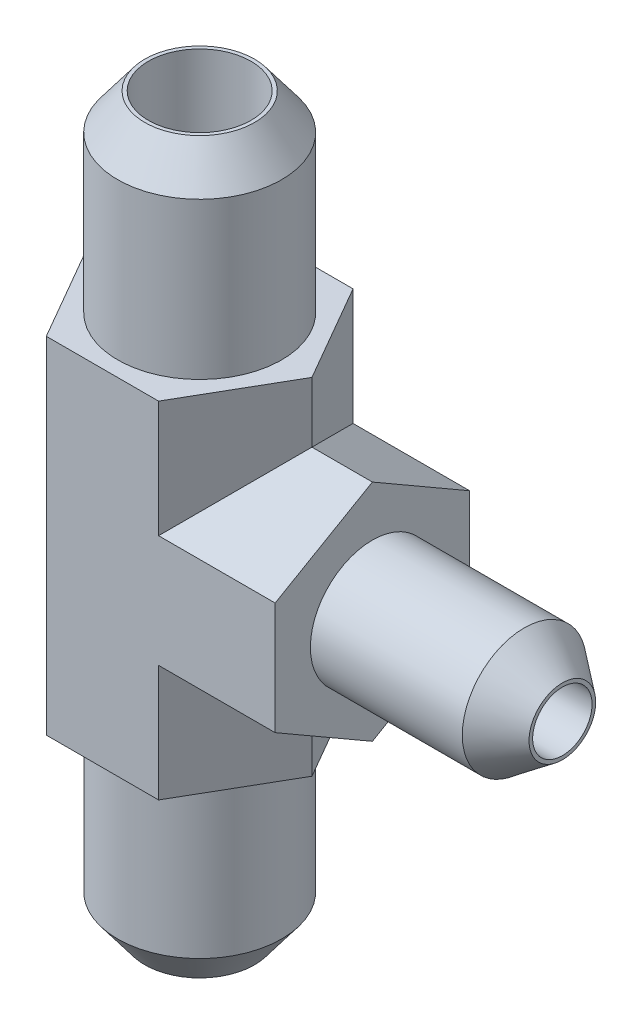
ISO-10303-21;
HEADER;
FILE_DESCRIPTION(('STEP AP214'),'2;1');
FILE_NAME('part.step','',(''),(''),'','','');
FILE_SCHEMA(('AUTOMOTIVE_DESIGN { 1 0 10303 214 1 1 1 1 }'));
ENDSEC;
DATA;
#1=APPLICATION_CONTEXT('core data for automotive mechanical design processes');
#2=APPLICATION_PROTOCOL_DEFINITION('international standard','automotive_design',2000,#1);
#3=PRODUCT_CONTEXT('',#1,'mechanical');
#4=PRODUCT('Part','Part','',(#3));
#5=PRODUCT_RELATED_PRODUCT_CATEGORY('part','',(#4));
#6=PRODUCT_DEFINITION_FORMATION('','',#4);
#7=PRODUCT_DEFINITION_CONTEXT('part definition',#1,'design');
#8=PRODUCT_DEFINITION('design','',#6,#7);
#9=PRODUCT_DEFINITION_SHAPE('','',#8);
#10=(LENGTH_UNIT() NAMED_UNIT(*) SI_UNIT(.MILLI.,.METRE.));
#11=(NAMED_UNIT(*) PLANE_ANGLE_UNIT() SI_UNIT($,.RADIAN.));
#12=(NAMED_UNIT(*) SI_UNIT($,.STERADIAN.) SOLID_ANGLE_UNIT());
#13=UNCERTAINTY_MEASURE_WITH_UNIT(LENGTH_MEASURE(1.E-05),#10,'distance_accuracy_value','');
#14=(GEOMETRIC_REPRESENTATION_CONTEXT(3) GLOBAL_UNCERTAINTY_ASSIGNED_CONTEXT((#13)) GLOBAL_UNIT_ASSIGNED_CONTEXT((#10,
#11,#12)) REPRESENTATION_CONTEXT('',''));
#15=CARTESIAN_POINT('',(0.,0.,0.));
#16=DIRECTION('',(0.,0.,1.));
#17=DIRECTION('',(1.,0.,0.));
#18=AXIS2_PLACEMENT_3D('',#15,#16,#17);
#19=CARTESIAN_POINT('',(0.,-26.8224,0.));
#20=DIRECTION('',(0.,1.,0.));
#21=DIRECTION('',(0.,0.,1.));
#22=AXIS2_PLACEMENT_3D('',#19,#20,#21);
#23=CYLINDRICAL_SURFACE('',#22,6.0325);
#24=CARTESIAN_POINT('',(0.,-12.7,0.));
#25=DIRECTION('',(0.,-1.,0.));
#26=DIRECTION('',(0.,0.,-1.));
#27=AXIS2_PLACEMENT_3D('',#24,#25,#26);
#28=CIRCLE('',#27,6.0325);
#29=CARTESIAN_POINT('',(0.,-12.7,-6.0325));
#30=VERTEX_POINT('',#29);
#31=EDGE_CURVE('E11',#30,#30,#28,.T.);
#32=ORIENTED_EDGE('',*,*,#31,.T.);
#33=EDGE_LOOP('',(#32));
#34=FACE_BOUND('',#33,.T.);
#35=CARTESIAN_POINT('',(0.,-24.1764053301711,0.));
#36=DIRECTION('',(0.,1.,0.));
#37=DIRECTION('',(0.,0.,1.));
#38=AXIS2_PLACEMENT_3D('',#35,#36,#37);
#39=CIRCLE('',#38,6.0325);
#40=CARTESIAN_POINT('',(0.,-24.1764053301711,6.0325));
#41=VERTEX_POINT('',#40);
#42=EDGE_CURVE('E510',#41,#41,#39,.F.);
#43=ORIENTED_EDGE('',*,*,#42,.F.);
#44=EDGE_LOOP('',(#43));
#45=FACE_BOUND('',#44,.T.);
#46=ADVANCED_FACE('F34',(#34,#45),#23,.T.);
#47=CARTESIAN_POINT('',(26.67,0.,0.));
#48=DIRECTION('',(-1.,0.,0.));
#49=DIRECTION('',(0.,0.,1.));
#50=AXIS2_PLACEMENT_3D('',#47,#48,#49);
#51=CYLINDRICAL_SURFACE('',#50,4.5593);
#52=CARTESIAN_POINT('',(12.7,0.,0.));
#53=DIRECTION('',(1.,0.,0.));
#54=DIRECTION('',(0.,0.,-1.));
#55=AXIS2_PLACEMENT_3D('',#52,#53,#54);
#56=CIRCLE('',#55,4.5593);
#57=CARTESIAN_POINT('',(12.7,0.,-4.5593));
#58=VERTEX_POINT('',#57);
#59=EDGE_CURVE('E43',#58,#58,#56,.T.);
#60=ORIENTED_EDGE('',*,*,#59,.T.);
#61=EDGE_LOOP('',(#60));
#62=FACE_BOUND('',#61,.T.);
#63=CARTESIAN_POINT('',(23.8723241070599,0.,0.));
#64=DIRECTION('',(-1.,0.,0.));
#65=DIRECTION('',(0.,0.,1.));
#66=AXIS2_PLACEMENT_3D('',#63,#64,#65);
#67=CIRCLE('',#66,4.5593);
#68=CARTESIAN_POINT('',(23.8723241070599,0.,4.5593));
#69=VERTEX_POINT('',#68);
#70=EDGE_CURVE('E177',#69,#69,#67,.F.);
#71=ORIENTED_EDGE('',*,*,#70,.F.);
#72=EDGE_LOOP('',(#71));
#73=FACE_BOUND('',#72,.T.);
#74=ADVANCED_FACE('F278',(#62,#73),#51,.T.);
#75=CARTESIAN_POINT('',(4.12811215973278,12.7,7.15009999999998));
#76=DIRECTION('',(-0.866025403784442,0.,-0.499999999999995));
#77=DIRECTION('',(-0.499999999999995,0.,0.866025403784442));
#78=AXIS2_PLACEMENT_3D('',#75,#76,#77);
#79=PLANE('',#78);
#80=DIRECTION('',(-0.447213595499953,-0.447213595499959,0.774596669241486));
#81=VECTOR('',#80,1.);
#82=CARTESIAN_POINT('',(5.84248972778622,5.8424897277862,4.18071094877502));
#83=LINE('',#82,#81);
#84=CARTESIAN_POINT('',(8.25622431946552,8.25622431946547,0.));
#85=VERTEX_POINT('',#84);
#86=CARTESIAN_POINT('',(4.12811215973278,4.12811215973273,7.15009999999998));
#87=VERTEX_POINT('',#86);
#88=EDGE_CURVE('E38',#85,#87,#83,.T.);
#89=ORIENTED_EDGE('',*,*,#88,.F.);
#90=DIRECTION('',(0.,-1.,0.));
#91=VECTOR('',#90,1.);
#92=CARTESIAN_POINT('',(8.25622431946549,12.7,0.));
#93=LINE('',#92,#91);
#94=CARTESIAN_POINT('',(8.25622431946549,12.7,0.));
#95=VERTEX_POINT('',#94);
#96=EDGE_CURVE('E116',#95,#85,#93,.T.);
#97=ORIENTED_EDGE('',*,*,#96,.F.);
#98=DIRECTION('',(0.499999999999995,0.,-0.866025403784442));
#99=VECTOR('',#98,1.);
#100=CARTESIAN_POINT('',(4.12811215973278,12.7,7.15009999999998));
#101=LINE('',#100,#99);
#102=CARTESIAN_POINT('',(4.12811215973278,12.7,7.15009999999998));
#103=VERTEX_POINT('',#102);
#104=EDGE_CURVE('E102',#103,#95,#101,.T.);
#105=ORIENTED_EDGE('',*,*,#104,.F.);
#106=DIRECTION('',(0.,-1.,0.));
#107=VECTOR('',#106,1.);
#108=CARTESIAN_POINT('',(4.12811215973278,12.7,7.15009999999998));
#109=LINE('',#108,#107);
#110=EDGE_CURVE('E153',#103,#87,#109,.T.);
#111=ORIENTED_EDGE('',*,*,#110,.T.);
#112=EDGE_LOOP('',(#89,#97,#105,#111));
#113=FACE_BOUND('',#112,.T.);
#114=ADVANCED_FACE('F117',(#113),#79,.F.);
#115=DIRECTION('',(0.447213595499953,-0.447213595499959,-0.774596669241485));
#116=VECTOR('',#115,1.);
#117=CARTESIAN_POINT('',(0.762489727786258,-0.762489727786166,12.979529051225));
#118=LINE('',#117,#116);
#119=CARTESIAN_POINT('',(4.12811215973278,-4.12811215973273,7.15009999999998));
#120=VERTEX_POINT('',#119);
#121=CARTESIAN_POINT('',(8.25622431946552,-8.25622431946546,0.));
#122=VERTEX_POINT('',#121);
#123=EDGE_CURVE('E159',#120,#122,#118,.T.);
#124=ORIENTED_EDGE('',*,*,#123,.F.);
#125=CARTESIAN_POINT('',(4.12811215973278,-12.7,7.15009999999998));
#126=VERTEX_POINT('',#125);
#127=EDGE_CURVE('E122',#120,#126,#109,.T.);
#128=ORIENTED_EDGE('',*,*,#127,.T.);
#129=DIRECTION('',(0.499999999999995,0.,-0.866025403784442));
#130=VECTOR('',#129,1.);
#131=CARTESIAN_POINT('',(4.12811215973278,-12.7,7.15009999999998));
#132=LINE('',#131,#130);
#133=CARTESIAN_POINT('',(8.25622431946549,-12.7,0.));
#134=VERTEX_POINT('',#133);
#135=EDGE_CURVE('E142',#126,#134,#132,.T.);
#136=ORIENTED_EDGE('',*,*,#135,.T.);
#137=EDGE_CURVE('E123',#122,#134,#93,.T.);
#138=ORIENTED_EDGE('',*,*,#137,.F.);
#139=EDGE_LOOP('',(#124,#128,#136,#138));
#140=FACE_BOUND('',#139,.T.);
#141=ADVANCED_FACE('F258',(#140),#79,.F.);
#142=CARTESIAN_POINT('',(8.25622431946549,12.7,0.));
#143=DIRECTION('',(-0.866025403784435,0.,0.500000000000007));
#144=DIRECTION('',(0.500000000000007,0.,0.866025403784435));
#145=AXIS2_PLACEMENT_3D('',#142,#143,#144);
#146=PLANE('',#145);
#147=DIRECTION('',(0.447213595499965,0.447213595499956,0.77459666924148));
#148=VECTOR('',#147,1.);
#149=CARTESIAN_POINT('',(9.14497945557241,9.14497945557234,1.5393690512249));
#150=LINE('',#149,#148);
#151=CARTESIAN_POINT('',(4.12811215973268,4.12811215973274,-7.15009999999998));
#152=VERTEX_POINT('',#151);
#153=EDGE_CURVE('E137',#152,#85,#150,.T.);
#154=ORIENTED_EDGE('',*,*,#153,.F.);
#155=DIRECTION('',(0.,-1.,0.));
#156=VECTOR('',#155,1.);
#157=CARTESIAN_POINT('',(4.12811215973268,12.7,-7.15010000000004));
#158=LINE('',#157,#156);
#159=CARTESIAN_POINT('',(4.12811215973268,12.7,-7.15010000000004));
#160=VERTEX_POINT('',#159);
#161=EDGE_CURVE('E127',#160,#152,#158,.T.);
#162=ORIENTED_EDGE('',*,*,#161,.F.);
#163=DIRECTION('',(-0.500000000000007,0.,-0.866025403784435));
#164=VECTOR('',#163,1.);
#165=CARTESIAN_POINT('',(8.25622431946549,12.7,0.));
#166=LINE('',#165,#164);
#167=EDGE_CURVE('E106',#95,#160,#166,.T.);
#168=ORIENTED_EDGE('',*,*,#167,.F.);
#169=ORIENTED_EDGE('',*,*,#96,.T.);
#170=EDGE_LOOP('',(#154,#162,#168,#169));
#171=FACE_BOUND('',#170,.T.);
#172=ADVANCED_FACE('F125',(#171),#146,.F.);
#173=DIRECTION('',(-0.447213595499965,0.447213595499956,-0.774596669241481));
#174=VECTOR('',#173,1.);
#175=CARTESIAN_POINT('',(4.06497945557236,-4.06497945557238,-7.25944905122493));
#176=LINE('',#175,#174);
#177=CARTESIAN_POINT('',(4.12811215973268,-4.12811215973271,-7.15010000000004));
#178=VERTEX_POINT('',#177);
#179=EDGE_CURVE('E209',#122,#178,#176,.T.);
#180=ORIENTED_EDGE('',*,*,#179,.F.);
#181=ORIENTED_EDGE('',*,*,#137,.T.);
#182=DIRECTION('',(-0.500000000000007,0.,-0.866025403784435));
#183=VECTOR('',#182,1.);
#184=CARTESIAN_POINT('',(8.25622431946549,-12.7,0.));
#185=LINE('',#184,#183);
#186=CARTESIAN_POINT('',(4.12811215973268,-12.7,-7.15010000000004));
#187=VERTEX_POINT('',#186);
#188=EDGE_CURVE('E145',#134,#187,#185,.T.);
#189=ORIENTED_EDGE('',*,*,#188,.T.);
#190=EDGE_CURVE('E151',#178,#187,#158,.T.);
#191=ORIENTED_EDGE('',*,*,#190,.F.);
#192=EDGE_LOOP('',(#180,#181,#189,#191));
#193=FACE_BOUND('',#192,.T.);
#194=ADVANCED_FACE('F262',(#193),#146,.F.);
#195=CARTESIAN_POINT('',(-4.12811215973283,12.7,-7.15009999999995));
#196=DIRECTION('',(0.866025403784442,0.,0.499999999999995));
#197=DIRECTION('',(0.499999999999995,0.,-0.866025403784442));
#198=AXIS2_PLACEMENT_3D('',#195,#196,#197);
#199=PLANE('',#198);
#200=DIRECTION('',(-0.499999999999995,0.,0.866025403784442));
#201=VECTOR('',#200,1.);
#202=CARTESIAN_POINT('',(-4.12811215973283,-12.7,-7.15009999999995));
#203=LINE('',#202,#201);
#204=CARTESIAN_POINT('',(-4.12811215973283,-12.7,-7.15009999999995));
#205=VERTEX_POINT('',#204);
#206=CARTESIAN_POINT('',(-8.25622431946549,-12.7,0.));
#207=VERTEX_POINT('',#206);
#208=EDGE_CURVE('E133',#205,#207,#203,.T.);
#209=ORIENTED_EDGE('',*,*,#208,.T.);
#210=DIRECTION('',(0.,-1.,0.));
#211=VECTOR('',#210,1.);
#212=CARTESIAN_POINT('',(-8.25622431946549,12.7,0.));
#213=LINE('',#212,#211);
#214=CARTESIAN_POINT('',(-8.25622431946549,12.7,0.));
#215=VERTEX_POINT('',#214);
#216=EDGE_CURVE('E158',#215,#207,#213,.T.);
#217=ORIENTED_EDGE('',*,*,#216,.F.);
#218=DIRECTION('',(-0.499999999999995,0.,0.866025403784442));
#219=VECTOR('',#218,1.);
#220=CARTESIAN_POINT('',(-4.12811215973283,12.7,-7.15009999999995));
#221=LINE('',#220,#219);
#222=CARTESIAN_POINT('',(-4.12811215973283,12.7,-7.15009999999995));
#223=VERTEX_POINT('',#222);
#224=EDGE_CURVE('E149',#223,#215,#221,.T.);
#225=ORIENTED_EDGE('',*,*,#224,.F.);
#226=DIRECTION('',(0.,-1.,0.));
#227=VECTOR('',#226,1.);
#228=CARTESIAN_POINT('',(-4.12811215973283,12.7,-7.15009999999995));
#229=LINE('',#228,#227);
#230=EDGE_CURVE('E129',#223,#205,#229,.T.);
#231=ORIENTED_EDGE('',*,*,#230,.T.);
#232=EDGE_LOOP('',(#209,#217,#225,#231));
#233=FACE_BOUND('',#232,.T.);
#234=ADVANCED_FACE('F36',(#233),#199,.F.);
#235=CARTESIAN_POINT('',(-8.25622431946549,12.7,0.));
#236=DIRECTION('',(0.866025403784438,0.,-0.500000000000001));
#237=DIRECTION('',(-0.500000000000001,0.,-0.866025403784438));
#238=AXIS2_PLACEMENT_3D('',#235,#236,#237);
#239=PLANE('',#238);
#240=DIRECTION('',(0.500000000000001,0.,0.866025403784438));
#241=VECTOR('',#240,1.);
#242=CARTESIAN_POINT('',(-8.25622431946549,-12.7,0.));
#243=LINE('',#242,#241);
#244=CARTESIAN_POINT('',(-4.12811215973273,-12.7,7.15010000000001));
#245=VERTEX_POINT('',#244);
#246=EDGE_CURVE('E136',#207,#245,#243,.T.);
#247=ORIENTED_EDGE('',*,*,#246,.T.);
#248=DIRECTION('',(0.,-1.,0.));
#249=VECTOR('',#248,1.);
#250=CARTESIAN_POINT('',(-4.12811215973273,12.7,7.15010000000001));
#251=LINE('',#250,#249);
#252=CARTESIAN_POINT('',(-4.12811215973273,12.7,7.15010000000001));
#253=VERTEX_POINT('',#252);
#254=EDGE_CURVE('E155',#253,#245,#251,.T.);
#255=ORIENTED_EDGE('',*,*,#254,.F.);
#256=DIRECTION('',(0.500000000000001,0.,0.866025403784438));
#257=VECTOR('',#256,1.);
#258=CARTESIAN_POINT('',(-8.25622431946549,12.7,0.));
#259=LINE('',#258,#257);
#260=EDGE_CURVE('E93',#215,#253,#259,.T.);
#261=ORIENTED_EDGE('',*,*,#260,.F.);
#262=ORIENTED_EDGE('',*,*,#216,.T.);
#263=EDGE_LOOP('',(#247,#255,#261,#262));
#264=FACE_BOUND('',#263,.T.);
#265=ADVANCED_FACE('F216',(#264),#239,.F.);
#266=CARTESIAN_POINT('',(-4.12811215973273,12.7,7.15010000000001));
#267=DIRECTION('',(0.,0.,-1.));
#268=DIRECTION('',(-1.,0.,0.));
#269=AXIS2_PLACEMENT_3D('',#266,#267,#268);
#270=PLANE('',#269);
#271=ORIENTED_EDGE('',*,*,#127,.F.);
#272=DIRECTION('',(-1.,0.,0.));
#273=VECTOR('',#272,1.);
#274=CARTESIAN_POINT('',(12.7,-4.12811215973273,7.15009999999998));
#275=LINE('',#274,#273);
#276=CARTESIAN_POINT('',(12.7,-4.12811215973273,7.15009999999998));
#277=VERTEX_POINT('',#276);
#278=EDGE_CURVE('E203',#277,#120,#275,.T.);
#279=ORIENTED_EDGE('',*,*,#278,.F.);
#280=DIRECTION('',(0.,-1.,0.));
#281=VECTOR('',#280,1.);
#282=CARTESIAN_POINT('',(12.7,4.12811215973273,7.15009999999998));
#283=LINE('',#282,#281);
#284=CARTESIAN_POINT('',(12.7,4.12811215973273,7.15009999999998));
#285=VERTEX_POINT('',#284);
#286=EDGE_CURVE('E185',#285,#277,#283,.T.);
#287=ORIENTED_EDGE('',*,*,#286,.F.);
#288=DIRECTION('',(-1.,0.,0.));
#289=VECTOR('',#288,1.);
#290=CARTESIAN_POINT('',(12.7,4.12811215973273,7.15009999999998));
#291=LINE('',#290,#289);
#292=EDGE_CURVE('E205',#285,#87,#291,.T.);
#293=ORIENTED_EDGE('',*,*,#292,.T.);
#294=ORIENTED_EDGE('',*,*,#110,.F.);
#295=DIRECTION('',(1.,0.,0.));
#296=VECTOR('',#295,1.);
#297=CARTESIAN_POINT('',(-4.12811215973273,12.7,7.15010000000001));
#298=LINE('',#297,#296);
#299=EDGE_CURVE('E109',#253,#103,#298,.T.);
#300=ORIENTED_EDGE('',*,*,#299,.F.);
#301=ORIENTED_EDGE('',*,*,#254,.T.);
#302=DIRECTION('',(1.,0.,0.));
#303=VECTOR('',#302,1.);
#304=CARTESIAN_POINT('',(-4.12811215973273,-12.7,7.15010000000001));
#305=LINE('',#304,#303);
#306=EDGE_CURVE('E139',#245,#126,#305,.T.);
#307=ORIENTED_EDGE('',*,*,#306,.T.);
#308=EDGE_LOOP('',(#271,#279,#287,#293,#294,#300,#301,#307));
#309=FACE_BOUND('',#308,.T.);
#310=ADVANCED_FACE('F220',(#309),#270,.F.);
#311=CARTESIAN_POINT('',(4.12811215973268,12.7,-7.15010000000004));
#312=DIRECTION('',(0.,0.,1.));
#313=DIRECTION('',(1.,0.,0.));
#314=AXIS2_PLACEMENT_3D('',#311,#312,#313);
#315=PLANE('',#314);
#316=ORIENTED_EDGE('',*,*,#161,.T.);
#317=DIRECTION('',(-1.,0.,0.));
#318=VECTOR('',#317,1.);
#319=CARTESIAN_POINT('',(12.7,4.12811215973274,-7.15009999999998));
#320=LINE('',#319,#318);
#321=CARTESIAN_POINT('',(12.7,4.12811215973274,-7.15009999999998));
#322=VERTEX_POINT('',#321);
#323=EDGE_CURVE('E197',#322,#152,#320,.T.);
#324=ORIENTED_EDGE('',*,*,#323,.F.);
#325=DIRECTION('',(0.,1.,0.));
#326=VECTOR('',#325,1.);
#327=CARTESIAN_POINT('',(12.7,-4.12811215973273,-7.15009999999998));
#328=LINE('',#327,#326);
#329=CARTESIAN_POINT('',(12.7,-4.12811215973273,-7.15009999999998));
#330=VERTEX_POINT('',#329);
#331=EDGE_CURVE('E194',#330,#322,#328,.T.);
#332=ORIENTED_EDGE('',*,*,#331,.F.);
#333=DIRECTION('',(-1.,0.,0.));
#334=VECTOR('',#333,1.);
#335=CARTESIAN_POINT('',(12.7,-4.12811215973273,-7.15009999999998));
#336=LINE('',#335,#334);
#337=EDGE_CURVE('E51',#330,#178,#336,.T.);
#338=ORIENTED_EDGE('',*,*,#337,.T.);
#339=ORIENTED_EDGE('',*,*,#190,.T.);
#340=DIRECTION('',(-1.,0.,0.));
#341=VECTOR('',#340,1.);
#342=CARTESIAN_POINT('',(4.12811215973268,-12.7,-7.15010000000004));
#343=LINE('',#342,#341);
#344=EDGE_CURVE('E84',#187,#205,#343,.T.);
#345=ORIENTED_EDGE('',*,*,#344,.T.);
#346=ORIENTED_EDGE('',*,*,#230,.F.);
#347=DIRECTION('',(-1.,0.,0.));
#348=VECTOR('',#347,1.);
#349=CARTESIAN_POINT('',(4.12811215973268,12.7,-7.15010000000004));
#350=LINE('',#349,#348);
#351=EDGE_CURVE('E60',#160,#223,#350,.T.);
#352=ORIENTED_EDGE('',*,*,#351,.F.);
#353=EDGE_LOOP('',(#316,#324,#332,#338,#339,#345,#346,#352));
#354=FACE_BOUND('',#353,.T.);
#355=ADVANCED_FACE('F250',(#354),#315,.F.);
#356=CARTESIAN_POINT('',(0.,12.7,0.));
#357=DIRECTION('',(0.,1.,0.));
#358=DIRECTION('',(0.,0.,1.));
#359=AXIS2_PLACEMENT_3D('',#356,#357,#358);
#360=PLANE('',#359);
#361=CARTESIAN_POINT('',(0.,12.7,0.));
#362=DIRECTION('',(0.,-1.,0.));
#363=DIRECTION('',(0.,0.,-1.));
#364=AXIS2_PLACEMENT_3D('',#361,#362,#363);
#365=CIRCLE('',#364,6.0325);
#366=CARTESIAN_POINT('',(0.,12.7,-6.0325));
#367=VERTEX_POINT('',#366);
#368=EDGE_CURVE('E504',#367,#367,#365,.T.);
#369=ORIENTED_EDGE('',*,*,#368,.T.);
#370=EDGE_LOOP('',(#369));
#371=FACE_BOUND('',#370,.T.);
#372=ORIENTED_EDGE('',*,*,#224,.T.);
#373=ORIENTED_EDGE('',*,*,#260,.T.);
#374=ORIENTED_EDGE('',*,*,#299,.T.);
#375=ORIENTED_EDGE('',*,*,#104,.T.);
#376=ORIENTED_EDGE('',*,*,#167,.T.);
#377=ORIENTED_EDGE('',*,*,#351,.T.);
#378=EDGE_LOOP('',(#372,#373,#374,#375,#376,#377));
#379=FACE_BOUND('',#378,.T.);
#380=ADVANCED_FACE('F104',(#371,#379),#360,.T.);
#381=CARTESIAN_POINT('',(0.,-12.7,0.));
#382=DIRECTION('',(0.,1.,0.));
#383=DIRECTION('',(0.,0.,1.));
#384=AXIS2_PLACEMENT_3D('',#381,#382,#383);
#385=PLANE('',#384);
#386=ORIENTED_EDGE('',*,*,#31,.F.);
#387=EDGE_LOOP('',(#386));
#388=FACE_BOUND('',#387,.T.);
#389=ORIENTED_EDGE('',*,*,#208,.F.);
#390=ORIENTED_EDGE('',*,*,#344,.F.);
#391=ORIENTED_EDGE('',*,*,#188,.F.);
#392=ORIENTED_EDGE('',*,*,#135,.F.);
#393=ORIENTED_EDGE('',*,*,#306,.F.);
#394=ORIENTED_EDGE('',*,*,#246,.F.);
#395=EDGE_LOOP('',(#389,#390,#391,#392,#393,#394));
#396=FACE_BOUND('',#395,.T.);
#397=ADVANCED_FACE('F254',(#388,#396),#385,.F.);
#398=CARTESIAN_POINT('',(12.7,8.25622431946547,0.));
#399=DIRECTION('',(0.,-0.866025403784439,-0.5));
#400=DIRECTION('',(0.,0.5,-0.866025403784439));
#401=AXIS2_PLACEMENT_3D('',#398,#399,#400);
#402=PLANE('',#401);
#403=DIRECTION('',(-1.,0.,0.));
#404=VECTOR('',#403,1.);
#405=CARTESIAN_POINT('',(12.7,8.25622431946547,0.));
#406=LINE('',#405,#404);
#407=CARTESIAN_POINT('',(12.7,8.25622431946547,0.));
#408=VERTEX_POINT('',#407);
#409=EDGE_CURVE('E207',#408,#85,#406,.T.);
#410=ORIENTED_EDGE('',*,*,#409,.T.);
#411=ORIENTED_EDGE('',*,*,#88,.T.);
#412=ORIENTED_EDGE('',*,*,#292,.F.);
#413=DIRECTION('',(0.,-0.5,0.866025403784439));
#414=VECTOR('',#413,1.);
#415=CARTESIAN_POINT('',(12.7,8.25622431946547,0.));
#416=LINE('',#415,#414);
#417=EDGE_CURVE('E182',#408,#285,#416,.T.);
#418=ORIENTED_EDGE('',*,*,#417,.F.);
#419=EDGE_LOOP('',(#410,#411,#412,#418));
#420=FACE_BOUND('',#419,.T.);
#421=ADVANCED_FACE('F242',(#420),#402,.F.);
#422=CARTESIAN_POINT('',(12.7,-4.12811215973273,7.15009999999998));
#423=DIRECTION('',(0.,0.866025403784439,-0.5));
#424=DIRECTION('',(0.,0.5,0.866025403784439));
#425=AXIS2_PLACEMENT_3D('',#422,#423,#424);
#426=PLANE('',#425);
#427=ORIENTED_EDGE('',*,*,#278,.T.);
#428=ORIENTED_EDGE('',*,*,#123,.T.);
#429=DIRECTION('',(-1.,0.,0.));
#430=VECTOR('',#429,1.);
#431=CARTESIAN_POINT('',(12.7,-8.25622431946546,0.));
#432=LINE('',#431,#430);
#433=CARTESIAN_POINT('',(12.7,-8.25622431946546,0.));
#434=VERTEX_POINT('',#433);
#435=EDGE_CURVE('E201',#434,#122,#432,.T.);
#436=ORIENTED_EDGE('',*,*,#435,.F.);
#437=DIRECTION('',(0.,-0.5,-0.866025403784439));
#438=VECTOR('',#437,1.);
#439=CARTESIAN_POINT('',(12.7,-4.12811215973273,7.15009999999998));
#440=LINE('',#439,#438);
#441=EDGE_CURVE('E188',#277,#434,#440,.T.);
#442=ORIENTED_EDGE('',*,*,#441,.F.);
#443=EDGE_LOOP('',(#427,#428,#436,#442));
#444=FACE_BOUND('',#443,.T.);
#445=ADVANCED_FACE('F267',(#444),#426,.F.);
#446=CARTESIAN_POINT('',(12.7,4.12811215973274,-7.15009999999998));
#447=DIRECTION('',(0.,-0.866025403784439,0.5));
#448=DIRECTION('',(0.,-0.5,-0.866025403784439));
#449=AXIS2_PLACEMENT_3D('',#446,#447,#448);
#450=PLANE('',#449);
#451=ORIENTED_EDGE('',*,*,#323,.T.);
#452=ORIENTED_EDGE('',*,*,#153,.T.);
#453=ORIENTED_EDGE('',*,*,#409,.F.);
#454=DIRECTION('',(0.,0.5,0.866025403784439));
#455=VECTOR('',#454,1.);
#456=CARTESIAN_POINT('',(12.7,4.12811215973274,-7.15009999999998));
#457=LINE('',#456,#455);
#458=EDGE_CURVE('E179',#322,#408,#457,.T.);
#459=ORIENTED_EDGE('',*,*,#458,.F.);
#460=EDGE_LOOP('',(#451,#452,#453,#459));
#461=FACE_BOUND('',#460,.T.);
#462=ADVANCED_FACE('F249',(#461),#450,.F.);
#463=CARTESIAN_POINT('',(12.7,-8.25622431946546,0.));
#464=DIRECTION('',(0.,0.866025403784439,0.5));
#465=DIRECTION('',(0.,-0.5,0.866025403784439));
#466=AXIS2_PLACEMENT_3D('',#463,#464,#465);
#467=PLANE('',#466);
#468=ORIENTED_EDGE('',*,*,#435,.T.);
#469=ORIENTED_EDGE('',*,*,#179,.T.);
#470=ORIENTED_EDGE('',*,*,#337,.F.);
#471=DIRECTION('',(0.,0.5,-0.866025403784439));
#472=VECTOR('',#471,1.);
#473=CARTESIAN_POINT('',(12.7,-8.25622431946546,0.));
#474=LINE('',#473,#472);
#475=EDGE_CURVE('E191',#434,#330,#474,.T.);
#476=ORIENTED_EDGE('',*,*,#475,.F.);
#477=EDGE_LOOP('',(#468,#469,#470,#476));
#478=FACE_BOUND('',#477,.T.);
#479=ADVANCED_FACE('F265',(#478),#467,.F.);
#480=CARTESIAN_POINT('',(12.7,0.,0.));
#481=DIRECTION('',(1.,0.,0.));
#482=DIRECTION('',(0.,0.,-1.));
#483=AXIS2_PLACEMENT_3D('',#480,#481,#482);
#484=PLANE('',#483);
#485=ORIENTED_EDGE('',*,*,#59,.F.);
#486=EDGE_LOOP('',(#485));
#487=FACE_BOUND('',#486,.T.);
#488=ORIENTED_EDGE('',*,*,#458,.T.);
#489=ORIENTED_EDGE('',*,*,#417,.T.);
#490=ORIENTED_EDGE('',*,*,#286,.T.);
#491=ORIENTED_EDGE('',*,*,#441,.T.);
#492=ORIENTED_EDGE('',*,*,#475,.T.);
#493=ORIENTED_EDGE('',*,*,#331,.T.);
#494=EDGE_LOOP('',(#488,#489,#490,#491,#492,#493));
#495=FACE_BOUND('',#494,.T.);
#496=ADVANCED_FACE('F246',(#487,#495),#484,.T.);
#497=CARTESIAN_POINT('',(26.67,0.,0.));
#498=DIRECTION('',(-1.,0.,0.));
#499=DIRECTION('',(0.,0.,-1.));
#500=AXIS2_PLACEMENT_3D('',#497,#498,#499);
#501=CONICAL_SURFACE('',#500,2.4511,0.645771823237903);
#502=CARTESIAN_POINT('',(26.67,0.,0.));
#503=DIRECTION('',(1.,0.,0.));
#504=DIRECTION('',(0.,0.,-1.));
#505=AXIS2_PLACEMENT_3D('',#502,#503,#504);
#506=CIRCLE('',#505,2.4511);
#507=CARTESIAN_POINT('',(26.67,0.,-2.4511));
#508=VERTEX_POINT('',#507);
#509=EDGE_CURVE('E518',#508,#508,#506,.T.);
#510=ORIENTED_EDGE('',*,*,#509,.F.);
#511=EDGE_LOOP('',(#510));
#512=FACE_BOUND('',#511,.T.);
#513=ORIENTED_EDGE('',*,*,#70,.T.);
#514=EDGE_LOOP('',(#513));
#515=FACE_BOUND('',#514,.T.);
#516=ADVANCED_FACE('F290',(#512,#515),#501,.T.);
#517=CARTESIAN_POINT('',(26.67,0.,0.));
#518=DIRECTION('',(1.,0.,0.));
#519=DIRECTION('',(0.,0.,-1.));
#520=AXIS2_PLACEMENT_3D('',#517,#518,#519);
#521=PLANE('',#520);
#522=CARTESIAN_POINT('',(26.67,0.,0.));
#523=DIRECTION('',(1.,0.,0.));
#524=DIRECTION('',(0.,0.,-1.));
#525=AXIS2_PLACEMENT_3D('',#522,#523,#524);
#526=CIRCLE('',#525,2.1844);
#527=CARTESIAN_POINT('',(26.67,0.,-2.1844));
#528=VERTEX_POINT('',#527);
#529=EDGE_CURVE('E534',#528,#528,#526,.T.);
#530=ORIENTED_EDGE('',*,*,#529,.F.);
#531=EDGE_LOOP('',(#530));
#532=FACE_BOUND('',#531,.T.);
#533=ORIENTED_EDGE('',*,*,#509,.T.);
#534=EDGE_LOOP('',(#533));
#535=FACE_BOUND('',#534,.T.);
#536=ADVANCED_FACE('F293',(#532,#535),#521,.T.);
#537=CARTESIAN_POINT('',(0.,-26.8224,0.));
#538=DIRECTION('',(0.,1.,0.));
#539=DIRECTION('',(0.,0.,-1.));
#540=AXIS2_PLACEMENT_3D('',#537,#538,#539);
#541=CONICAL_SURFACE('',#540,4.0386,0.645771823237903);
#542=CARTESIAN_POINT('',(0.,-26.8224,0.));
#543=DIRECTION('',(0.,-1.,0.));
#544=DIRECTION('',(0.,0.,-1.));
#545=AXIS2_PLACEMENT_3D('',#542,#543,#544);
#546=CIRCLE('',#545,4.0386);
#547=CARTESIAN_POINT('',(0.,-26.8224,-4.0386));
#548=VERTEX_POINT('',#547);
#549=EDGE_CURVE('E506',#548,#548,#546,.T.);
#550=ORIENTED_EDGE('',*,*,#549,.F.);
#551=EDGE_LOOP('',(#550));
#552=FACE_BOUND('',#551,.T.);
#553=ORIENTED_EDGE('',*,*,#42,.T.);
#554=EDGE_LOOP('',(#553));
#555=FACE_BOUND('',#554,.T.);
#556=ADVANCED_FACE('F296',(#552,#555),#541,.T.);
#557=CARTESIAN_POINT('',(0.,-26.8224,0.));
#558=DIRECTION('',(0.,-1.,0.));
#559=DIRECTION('',(0.,0.,-1.));
#560=AXIS2_PLACEMENT_3D('',#557,#558,#559);
#561=PLANE('',#560);
#562=CARTESIAN_POINT('',(0.,-26.8224,0.));
#563=DIRECTION('',(0.,-1.,0.));
#564=DIRECTION('',(0.,0.,-1.));
#565=AXIS2_PLACEMENT_3D('',#562,#563,#564);
#566=CIRCLE('',#565,3.7719);
#567=CARTESIAN_POINT('',(0.,-26.8224,-3.7719));
#568=VERTEX_POINT('',#567);
#569=EDGE_CURVE('E531',#568,#568,#566,.T.);
#570=ORIENTED_EDGE('',*,*,#569,.F.);
#571=EDGE_LOOP('',(#570));
#572=FACE_BOUND('',#571,.T.);
#573=ORIENTED_EDGE('',*,*,#549,.T.);
#574=EDGE_LOOP('',(#573));
#575=FACE_BOUND('',#574,.T.);
#576=ADVANCED_FACE('F288',(#572,#575),#561,.T.);
#577=CARTESIAN_POINT('',(0.,26.8224,0.));
#578=DIRECTION('',(0.,-1.,0.));
#579=DIRECTION('',(0.,0.,-1.));
#580=AXIS2_PLACEMENT_3D('',#577,#578,#579);
#581=CYLINDRICAL_SURFACE('',#580,6.0325);
#582=CARTESIAN_POINT('',(0.,24.1764053301711,0.));
#583=DIRECTION('',(0.,-1.,0.));
#584=DIRECTION('',(0.,0.,-1.));
#585=AXIS2_PLACEMENT_3D('',#582,#583,#584);
#586=CIRCLE('',#585,6.0325);
#587=CARTESIAN_POINT('',(0.,24.1764053301711,-6.0325));
#588=VERTEX_POINT('',#587);
#589=EDGE_CURVE('E507',#588,#588,#586,.F.);
#590=ORIENTED_EDGE('',*,*,#589,.F.);
#591=EDGE_LOOP('',(#590));
#592=FACE_BOUND('',#591,.T.);
#593=ORIENTED_EDGE('',*,*,#368,.F.);
#594=EDGE_LOOP('',(#593));
#595=FACE_BOUND('',#594,.T.);
#596=ADVANCED_FACE('F335',(#592,#595),#581,.T.);
#597=CARTESIAN_POINT('',(0.,26.8224,0.));
#598=DIRECTION('',(0.,-1.,0.));
#599=DIRECTION('',(0.,0.,-1.));
#600=AXIS2_PLACEMENT_3D('',#597,#598,#599);
#601=CONICAL_SURFACE('',#600,4.0386,0.645771823237903);
#602=ORIENTED_EDGE('',*,*,#589,.T.);
#603=EDGE_LOOP('',(#602));
#604=FACE_BOUND('',#603,.T.);
#605=CARTESIAN_POINT('',(0.,26.8224,0.));
#606=DIRECTION('',(0.,-1.,0.));
#607=DIRECTION('',(0.,0.,-1.));
#608=AXIS2_PLACEMENT_3D('',#605,#606,#607);
#609=CIRCLE('',#608,4.0386);
#610=CARTESIAN_POINT('',(0.,26.8224,-4.0386));
#611=VERTEX_POINT('',#610);
#612=EDGE_CURVE('E513',#611,#611,#609,.T.);
#613=ORIENTED_EDGE('',*,*,#612,.T.);
#614=EDGE_LOOP('',(#613));
#615=FACE_BOUND('',#614,.T.);
#616=ADVANCED_FACE('F343',(#604,#615),#601,.T.);
#617=CARTESIAN_POINT('',(0.,26.8224,0.));
#618=DIRECTION('',(0.,1.,0.));
#619=DIRECTION('',(0.,0.,-1.));
#620=AXIS2_PLACEMENT_3D('',#617,#618,#619);
#621=PLANE('',#620);
#622=CARTESIAN_POINT('',(0.,26.8224,0.));
#623=DIRECTION('',(0.,-1.,0.));
#624=DIRECTION('',(0.,0.,-1.));
#625=AXIS2_PLACEMENT_3D('',#622,#623,#624);
#626=CIRCLE('',#625,3.7719);
#627=CARTESIAN_POINT('',(0.,26.8224,-3.7719));
#628=VERTEX_POINT('',#627);
#629=EDGE_CURVE('E530',#628,#628,#626,.T.);
#630=ORIENTED_EDGE('',*,*,#629,.T.);
#631=EDGE_LOOP('',(#630));
#632=FACE_BOUND('',#631,.T.);
#633=ORIENTED_EDGE('',*,*,#612,.F.);
#634=EDGE_LOOP('',(#633));
#635=FACE_BOUND('',#634,.T.);
#636=ADVANCED_FACE('F350',(#632,#635),#621,.T.);
#637=CARTESIAN_POINT('',(0.,26.8224,0.));
#638=DIRECTION('',(0.,-1.,0.));
#639=DIRECTION('',(0.,0.,-1.));
#640=AXIS2_PLACEMENT_3D('',#637,#638,#639);
#641=CYLINDRICAL_SURFACE('',#640,3.7719);
#642=CARTESIAN_POINT('',(3.07500020325203,0.,-2.1844));
#643=CARTESIAN_POINT('',(3.07500129237482,-0.11081993809788,-2.1843994885043));
#644=CARTESIAN_POINT('',(3.08108120335322,-0.221644268880641,-2.17591436235926));
#645=CARTESIAN_POINT('',(3.10436821329971,-0.439626917894102,-2.14254993753321));
#646=CARTESIAN_POINT('',(3.12158687906281,-0.546781303220074,-2.11765359647605));
#647=CARTESIAN_POINT('',(3.16443859168481,-0.753838240428447,-2.05305408257304));
#648=CARTESIAN_POINT('',(3.19001536896573,-0.853783976375506,-2.0134496923602));
#649=CARTESIAN_POINT('',(3.24660137984818,-1.04556596049186,-1.92087150263732));
#650=CARTESIAN_POINT('',(3.27761235978112,-1.13739958744722,-1.86789340294322));
#651=CARTESIAN_POINT('',(3.34581809583471,-1.32174900843225,-1.74308201979404));
#652=CARTESIAN_POINT('',(3.38331560015504,-1.41316830858504,-1.66979425062132));
#653=CARTESIAN_POINT('',(3.45784080611447,-1.58331562390511,-1.50943482144169));
#654=CARTESIAN_POINT('',(3.49486817423251,-1.66203504756116,-1.42235390859768));
#655=CARTESIAN_POINT('',(3.56860660418207,-1.81218557974441,-1.22648272489408));
#656=CARTESIAN_POINT('',(3.60492901422496,-1.88214028659907,-1.1164000179996));
#657=CARTESIAN_POINT('',(3.66894327364527,-2.00202153463911,-0.883525094684566));
#658=CARTESIAN_POINT('',(3.69664245784897,-2.05196510752477,-0.760743798649437));
#659=CARTESIAN_POINT('',(3.73805245673772,-2.12561703456925,-0.517679186045413));
#660=CARTESIAN_POINT('',(3.75280056893149,-2.15128720256534,-0.398171492212977));
#661=CARTESIAN_POINT('',(3.77063740654974,-2.18225799172222,-0.155723394893685));
#662=CARTESIAN_POINT('',(3.7737361343905,-2.18757608768785,-0.0327860276256305));
#663=CARTESIAN_POINT('',(3.7682735999323,-2.17813225787086,0.19770551841566));
#664=CARTESIAN_POINT('',(3.76102056781889,-2.1656235203185,0.305393055297207));
#665=CARTESIAN_POINT('',(3.73783753551939,-2.12510693657,0.516826858442216));
#666=CARTESIAN_POINT('',(3.7219068956682,-2.0970979477789,0.620572833552438));
#667=CARTESIAN_POINT('',(3.6825997900445,-2.02651870111727,0.822410219938285));
#668=CARTESIAN_POINT('',(3.65916394317367,-1.98383210869265,0.920448904962672));
#669=CARTESIAN_POINT('',(3.60677089055809,-1.88544482710176,1.10812434754326));
#670=CARTESIAN_POINT('',(3.57781210784298,-1.82974041991731,1.19775869446886));
#671=CARTESIAN_POINT('',(3.51296361806393,-1.69965533461137,1.37710526601052));
#672=CARTESIAN_POINT('',(3.47665987989965,-1.62386454299287,1.46564441083559));
#673=CARTESIAN_POINT('',(3.40295606300099,-1.45941464069533,1.62948126640803));
#674=CARTESIAN_POINT('',(3.36555465937175,-1.37073942185737,1.7047621370868));
#675=CARTESIAN_POINT('',(3.28938441919659,-1.17205313007616,1.84780967884485));
#676=CARTESIAN_POINT('',(3.25087749693355,-1.06078242309991,1.91398210375306));
#677=CARTESIAN_POINT('',(3.18211610979817,-0.826252846475458,2.02626047362466));
#678=CARTESIAN_POINT('',(3.15184685238585,-0.703016012055366,2.07240247751642));
#679=CARTESIAN_POINT('',(3.11040432392693,-0.477722518171157,2.13392889694278));
#680=CARTESIAN_POINT('',(3.09642002533868,-0.377457581261683,2.15398401835623));
#681=CARTESIAN_POINT('',(3.07827886627515,-0.174268330123536,2.17983785241284));
#682=CARTESIAN_POINT('',(3.07411207396871,-0.0713468100999569,2.18565097314222));
#683=CARTESIAN_POINT('',(3.07621001170372,0.134249705224133,2.18269616036803));
#684=CARTESIAN_POINT('',(3.08248290586175,0.23692444464255,2.17391681516908));
#685=CARTESIAN_POINT('',(3.10455499292899,0.439043753021974,2.14227137102914));
#686=CARTESIAN_POINT('',(3.12036129527159,0.538485852893976,2.11939475893114));
#687=CARTESIAN_POINT('',(3.15964353002364,0.732717046605752,2.06037290008373));
#688=CARTESIAN_POINT('',(3.18318853582933,0.827455047182107,2.02410777822183));
#689=CARTESIAN_POINT('',(3.23539668368474,1.00986126286837,1.93956251926675));
#690=CARTESIAN_POINT('',(3.26406187039512,1.09752663326178,1.89127757921188));
#691=CARTESIAN_POINT('',(3.32916530972707,1.27909265725656,1.77456211134215));
#692=CARTESIAN_POINT('',(3.36609611898222,1.37151452804615,1.7041014406766));
#693=CARTESIAN_POINT('',(3.44003344211999,1.54411483627775,1.54943799668595));
#694=CARTESIAN_POINT('',(3.47703999390014,1.62428256554716,1.46522333596125));
#695=CARTESIAN_POINT('',(3.55167505864844,1.77871293047315,1.27451919181389));
#696=CARTESIAN_POINT('',(3.58894258369685,1.85141372516775,1.16660826169241));
#697=CARTESIAN_POINT('',(3.65543391521974,1.97722648447214,0.937655895002155));
#698=CARTESIAN_POINT('',(3.6846638713609,2.03035343596599,0.816624596441826));
#699=CARTESIAN_POINT('',(3.7296897284771,2.11091961414808,0.574915339470101));
#700=CARTESIAN_POINT('',(3.74637011783046,2.14006763644959,0.454976868583776));
#701=CARTESIAN_POINT('',(3.76798450569161,2.17768876969271,0.210900843180821));
#702=CARTESIAN_POINT('',(3.77292961855133,2.18618144327885,0.086767374828438));
#703=CARTESIAN_POINT('',(3.77065241386774,2.18224258422442,-0.145949822692418));
#704=CARTESIAN_POINT('',(3.76482956166625,2.17221786450241,-0.254598150242803));
#705=CARTESIAN_POINT('',(3.74424811547666,2.13634831939095,-0.46836165440488));
#706=CARTESIAN_POINT('',(3.72948913638034,2.11050281219382,-0.57347667854048));
#707=CARTESIAN_POINT('',(3.69240701460911,2.04425801151997,-0.777217942324159));
#708=CARTESIAN_POINT('',(3.67010462023309,2.00389861969687,-0.875861103761828));
#709=CARTESIAN_POINT('',(3.61973018529358,1.91007461604658,-1.06507345352015));
#710=CARTESIAN_POINT('',(3.5916566533065,1.85660661589857,-1.1556405460666));
#711=CARTESIAN_POINT('',(3.52849989850206,1.73145097415285,-1.33682578792266));
#712=CARTESIAN_POINT('',(3.49298536645859,1.6584066529657,-1.42635528494027));
#713=CARTESIAN_POINT('',(3.42039227948931,1.4994859134569,-1.59260612931549));
#714=CARTESIAN_POINT('',(3.38331190827103,1.41359428219604,-1.66931206068416));
#715=CARTESIAN_POINT('',(3.30690966784733,1.22015770069871,-1.8163625281976));
#716=CARTESIAN_POINT('',(3.26779475263016,1.11126798409847,-1.88506018041079));
#717=CARTESIAN_POINT('',(3.19691876477907,0.881221931590408,-2.00292098179755));
#718=CARTESIAN_POINT('',(3.16514755398369,0.760082842606928,-2.05211112955817));
#719=CARTESIAN_POINT('',(3.11923478939879,0.532793189355189,-2.12108073602245));
#720=CARTESIAN_POINT('',(3.10287372415435,0.428264718359601,-2.14470501601568));
#721=CARTESIAN_POINT('',(3.08076222662307,0.215822758173412,-2.17635559757539));
#722=CARTESIAN_POINT('',(3.07499914269367,0.107913461732895,-2.18440049808069));
#723=CARTESIAN_POINT('',(3.07500020325203,0.,-2.1844));
#724=B_SPLINE_CURVE_WITH_KNOTS('',3,(#642,#643,#644,#645,#646,#647,#648,#649,#650,#651,#652,
#653,#654,#655,#656,#657,#658,#659,#660,#661,#662,#663,#664,#665,#666,#667,#668,#669,#670,#671,
#672,#673,#674,#675,#676,#677,#678,#679,#680,#681,#682,#683,#684,#685,#686,#687,#688,#689,#690,
#691,#692,#693,#694,#695,#696,#697,#698,#699,#700,#701,#702,#703,#704,#705,#706,#707,#708,#709,
#710,#711,#712,#713,#714,#715,#716,#717,#718,#719,#720,#721,#722,#723),.UNSPECIFIED.,.T.,.F.,(4,
2,2,2,2,2,2,2,2,2,2,2,2,2,2,2,2,2,2,2,2,2,2,2,2,2,2,2,2,2,2,2,2,2,2,2,2,2,2,2,4),(0.,
0.33200807934652,0.664361479821287,0.994521939449956,1.32478869443186,1.69239130565039,
2.06024156787629,2.46424024957537,2.8678943493229,3.23509806241023,3.60198641425152,
3.92640397667999,4.25084545660809,4.57792010890203,4.90508829140509,5.26982695690746,
5.63502560750066,6.03818176979022,6.4406091265662,6.7488692825467,7.05681745453174,
7.36500656347916,7.6734257856941,7.98467622227812,8.29605123065666,8.66042930935515,
9.02512399839989,9.42903290141096,9.83263190218201,10.2040886423496,10.5751934392565,
10.9014078271401,11.2276362744459,11.5529746244074,11.8783971568421,12.2395900690338,
12.6012141185752,13.0029115344857,13.4040510404038,13.7277382005695,14.0510386984811),.UNSPECIFIED.);
#725=CARTESIAN_POINT('',(3.07500020325203,0.,-2.1844));
#726=VERTEX_POINT('',#725);
#727=EDGE_CURVE('E539',#726,#726,#724,.T.);
#728=ORIENTED_EDGE('',*,*,#727,.F.);
#729=EDGE_LOOP('',(#728));
#730=FACE_BOUND('',#729,.T.);
#731=ORIENTED_EDGE('',*,*,#629,.F.);
#732=EDGE_LOOP('',(#731));
#733=FACE_BOUND('',#732,.T.);
#734=ORIENTED_EDGE('',*,*,#569,.T.);
#735=EDGE_LOOP('',(#734));
#736=FACE_BOUND('',#735,.T.);
#737=ADVANCED_FACE('F357',(#730,#733,#736),#641,.F.);
#738=CARTESIAN_POINT('',(-8.25722431946549,0.,0.));
#739=DIRECTION('',(1.,0.,0.));
#740=DIRECTION('',(0.,0.,-1.));
#741=AXIS2_PLACEMENT_3D('',#738,#739,#740);
#742=CYLINDRICAL_SURFACE('',#741,2.1844);
#743=ORIENTED_EDGE('',*,*,#529,.T.);
#744=EDGE_LOOP('',(#743));
#745=FACE_BOUND('',#744,.T.);
#746=ORIENTED_EDGE('',*,*,#727,.T.);
#747=EDGE_LOOP('',(#746));
#748=FACE_BOUND('',#747,.T.);
#749=ADVANCED_FACE('F364',(#745,#748),#742,.F.);
#750=CLOSED_SHELL('',(#46,#74,#114,#141,#172,#194,#234,#265,#310,#355,#380,#397,#421,#445,#462,
#479,#496,#516,#536,#556,#576,#596,#616,#636,#737,#749));
#751=MANIFOLD_SOLID_BREP('B2',#750);
#752=ADVANCED_BREP_SHAPE_REPRESENTATION('',(#18,#751),#14);
#753=SHAPE_DEFINITION_REPRESENTATION(#9,#752);
ENDSEC;
END-ISO-10303-21;
